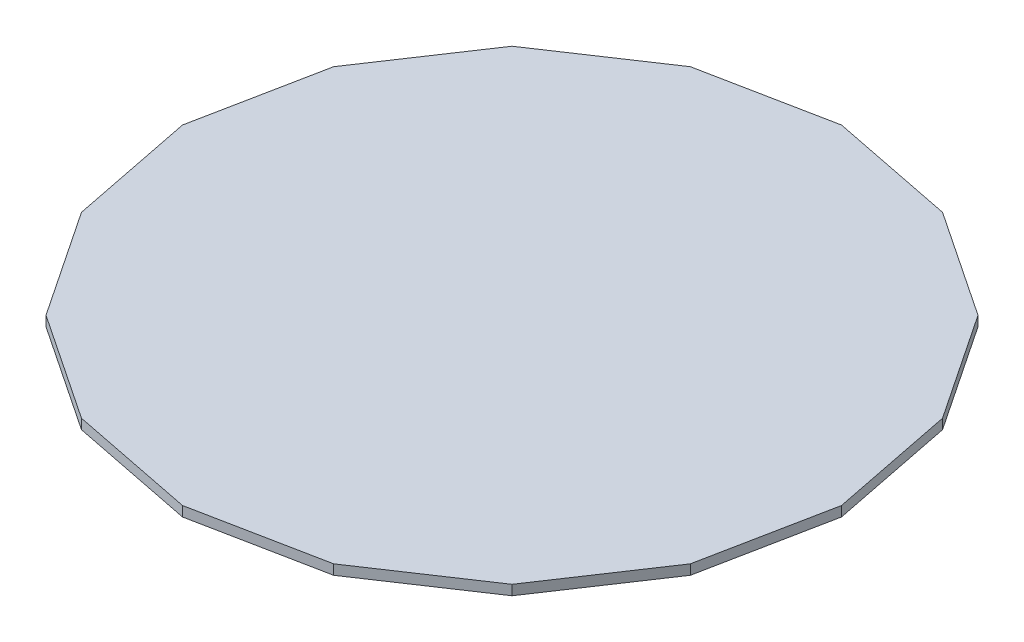
ISO-10303-21;
HEADER;
FILE_DESCRIPTION(('STEP AP214'),'2;1');
FILE_NAME('part.step','',(''),(''),'','','');
FILE_SCHEMA(('AUTOMOTIVE_DESIGN { 1 0 10303 214 1 1 1 1 }'));
ENDSEC;
DATA;
#1=APPLICATION_CONTEXT('core data for automotive mechanical design processes');
#2=APPLICATION_PROTOCOL_DEFINITION('international standard','automotive_design',2000,#1);
#3=PRODUCT_CONTEXT('',#1,'mechanical');
#4=PRODUCT('Part','Part','',(#3));
#5=PRODUCT_RELATED_PRODUCT_CATEGORY('part','',(#4));
#6=PRODUCT_DEFINITION_FORMATION('','',#4);
#7=PRODUCT_DEFINITION_CONTEXT('part definition',#1,'design');
#8=PRODUCT_DEFINITION('design','',#6,#7);
#9=PRODUCT_DEFINITION_SHAPE('','',#8);
#10=(LENGTH_UNIT() NAMED_UNIT(*) SI_UNIT(.MILLI.,.METRE.));
#11=(NAMED_UNIT(*) PLANE_ANGLE_UNIT() SI_UNIT($,.RADIAN.));
#12=(NAMED_UNIT(*) SI_UNIT($,.STERADIAN.) SOLID_ANGLE_UNIT());
#13=UNCERTAINTY_MEASURE_WITH_UNIT(LENGTH_MEASURE(1.E-05),#10,'distance_accuracy_value','');
#14=(GEOMETRIC_REPRESENTATION_CONTEXT(3) GLOBAL_UNCERTAINTY_ASSIGNED_CONTEXT((#13)) GLOBAL_UNIT_ASSIGNED_CONTEXT((#10,
#11,#12)) REPRESENTATION_CONTEXT('',''));
#15=CARTESIAN_POINT('',(0.,0.,0.));
#16=DIRECTION('',(0.,0.,1.));
#17=DIRECTION('',(1.,0.,0.));
#18=AXIS2_PLACEMENT_3D('',#15,#16,#17);
#19=CARTESIAN_POINT('',(61.2286611688793,2.,25.3617418620966));
#20=DIRECTION('',(-0.980785280403231,0.,-0.195090322016128));
#21=DIRECTION('',(-0.195090322016128,0.,0.98078528040323));
#22=AXIS2_PLACEMENT_3D('',#19,#20,#21);
#23=PLANE('',#22);
#24=DIRECTION('',(0.195090322016128,0.,-0.980785280403231));
#25=VECTOR('',#24,1.);
#26=CARTESIAN_POINT('',(61.2286611688793,0.,25.3617418620966));
#27=LINE('',#26,#25);
#28=CARTESIAN_POINT('',(61.2286611688793,0.,25.3617418620966));
#29=VERTEX_POINT('',#28);
#30=CARTESIAN_POINT('',(66.2734252835407,0.,0.));
#31=VERTEX_POINT('',#30);
#32=EDGE_CURVE('E194',#29,#31,#27,.T.);
#33=ORIENTED_EDGE('',*,*,#32,.T.);
#34=DIRECTION('',(0.,-1.,0.));
#35=VECTOR('',#34,1.);
#36=CARTESIAN_POINT('',(66.2734252835407,2.,0.));
#37=LINE('',#36,#35);
#38=CARTESIAN_POINT('',(66.2734252835407,2.,0.));
#39=VERTEX_POINT('',#38);
#40=EDGE_CURVE('E11',#39,#31,#37,.T.);
#41=ORIENTED_EDGE('',*,*,#40,.F.);
#42=DIRECTION('',(0.195090322016128,0.,-0.980785280403231));
#43=VECTOR('',#42,1.);
#44=CARTESIAN_POINT('',(61.2286611688793,2.,25.3617418620966));
#45=LINE('',#44,#43);
#46=CARTESIAN_POINT('',(61.2286611688793,2.,25.3617418620966));
#47=VERTEX_POINT('',#46);
#48=EDGE_CURVE('E240',#47,#39,#45,.T.);
#49=ORIENTED_EDGE('',*,*,#48,.F.);
#50=DIRECTION('',(0.,-1.,0.));
#51=VECTOR('',#50,1.);
#52=CARTESIAN_POINT('',(61.2286611688793,2.,25.3617418620966));
#53=LINE('',#52,#51);
#54=EDGE_CURVE('E190',#47,#29,#53,.T.);
#55=ORIENTED_EDGE('',*,*,#54,.T.);
#56=EDGE_LOOP('',(#33,#41,#49,#55));
#57=FACE_BOUND('',#56,.T.);
#58=ADVANCED_FACE('F45',(#57),#23,.F.);
#59=CARTESIAN_POINT('',(66.2734252835407,2.,0.));
#60=DIRECTION('',(-0.980785280403231,0.,0.195090322016128));
#61=DIRECTION('',(0.195090322016128,0.,0.98078528040323));
#62=AXIS2_PLACEMENT_3D('',#59,#60,#61);
#63=PLANE('',#62);
#64=DIRECTION('',(-0.195090322016128,0.,-0.980785280403231));
#65=VECTOR('',#64,1.);
#66=CARTESIAN_POINT('',(66.2734252835407,0.,0.));
#67=LINE('',#66,#65);
#68=CARTESIAN_POINT('',(61.2286611688793,0.,-25.3617418620967));
#69=VERTEX_POINT('',#68);
#70=EDGE_CURVE('E198',#31,#69,#67,.T.);
#71=ORIENTED_EDGE('',*,*,#70,.T.);
#72=DIRECTION('',(0.,-1.,0.));
#73=VECTOR('',#72,1.);
#74=CARTESIAN_POINT('',(61.2286611688793,2.,-25.3617418620967));
#75=LINE('',#74,#73);
#76=CARTESIAN_POINT('',(61.2286611688793,2.,-25.3617418620967));
#77=VERTEX_POINT('',#76);
#78=EDGE_CURVE('E54',#77,#69,#75,.T.);
#79=ORIENTED_EDGE('',*,*,#78,.F.);
#80=DIRECTION('',(-0.195090322016128,0.,-0.980785280403231));
#81=VECTOR('',#80,1.);
#82=CARTESIAN_POINT('',(66.2734252835407,2.,0.));
#83=LINE('',#82,#81);
#84=EDGE_CURVE('E129',#39,#77,#83,.T.);
#85=ORIENTED_EDGE('',*,*,#84,.F.);
#86=ORIENTED_EDGE('',*,*,#40,.T.);
#87=EDGE_LOOP('',(#71,#79,#85,#86));
#88=FACE_BOUND('',#87,.T.);
#89=ADVANCED_FACE('F362',(#88),#63,.F.);
#90=CARTESIAN_POINT('',(61.2286611688793,2.,-25.3617418620967));
#91=DIRECTION('',(-0.831469612302545,0.,0.555570233019603));
#92=DIRECTION('',(0.555570233019603,0.,0.831469612302545));
#93=AXIS2_PLACEMENT_3D('',#90,#91,#92);
#94=PLANE('',#93);
#95=DIRECTION('',(-0.555570233019603,0.,-0.831469612302545));
#96=VECTOR('',#95,1.);
#97=CARTESIAN_POINT('',(61.2286611688793,0.,-25.3617418620967));
#98=LINE('',#97,#96);
#99=CARTESIAN_POINT('',(46.8623884304516,0.,-46.8623884304517));
#100=VERTEX_POINT('',#99);
#101=EDGE_CURVE('E201',#69,#100,#98,.T.);
#102=ORIENTED_EDGE('',*,*,#101,.T.);
#103=DIRECTION('',(0.,-1.,0.));
#104=VECTOR('',#103,1.);
#105=CARTESIAN_POINT('',(46.8623884304516,2.,-46.8623884304517));
#106=LINE('',#105,#104);
#107=CARTESIAN_POINT('',(46.8623884304516,2.,-46.8623884304517));
#108=VERTEX_POINT('',#107);
#109=EDGE_CURVE('E283',#108,#100,#106,.T.);
#110=ORIENTED_EDGE('',*,*,#109,.F.);
#111=DIRECTION('',(-0.555570233019603,0.,-0.831469612302545));
#112=VECTOR('',#111,1.);
#113=CARTESIAN_POINT('',(61.2286611688793,2.,-25.3617418620967));
#114=LINE('',#113,#112);
#115=EDGE_CURVE('E293',#77,#108,#114,.T.);
#116=ORIENTED_EDGE('',*,*,#115,.F.);
#117=ORIENTED_EDGE('',*,*,#78,.T.);
#118=EDGE_LOOP('',(#102,#110,#116,#117));
#119=FACE_BOUND('',#118,.T.);
#120=ADVANCED_FACE('F291',(#119),#94,.F.);
#121=CARTESIAN_POINT('',(46.8623884304516,2.,-46.8623884304517));
#122=DIRECTION('',(-0.555570233019602,0.,0.831469612302546));
#123=DIRECTION('',(0.831469612302546,0.,0.555570233019602));
#124=AXIS2_PLACEMENT_3D('',#121,#122,#123);
#125=PLANE('',#124);
#126=DIRECTION('',(-0.831469612302545,0.,-0.555570233019602));
#127=VECTOR('',#126,1.);
#128=CARTESIAN_POINT('',(46.8623884304516,0.,-46.8623884304517));
#129=LINE('',#128,#127);
#130=CARTESIAN_POINT('',(25.3617418620967,0.,-61.2286611688793));
#131=VERTEX_POINT('',#130);
#132=EDGE_CURVE('E204',#100,#131,#129,.T.);
#133=ORIENTED_EDGE('',*,*,#132,.T.);
#134=DIRECTION('',(0.,-1.,0.));
#135=VECTOR('',#134,1.);
#136=CARTESIAN_POINT('',(25.3617418620967,2.,-61.2286611688793));
#137=LINE('',#136,#135);
#138=CARTESIAN_POINT('',(25.3617418620967,2.,-61.2286611688793));
#139=VERTEX_POINT('',#138);
#140=EDGE_CURVE('E279',#139,#131,#137,.T.);
#141=ORIENTED_EDGE('',*,*,#140,.F.);
#142=DIRECTION('',(-0.831469612302545,0.,-0.555570233019602));
#143=VECTOR('',#142,1.);
#144=CARTESIAN_POINT('',(46.8623884304516,2.,-46.8623884304517));
#145=LINE('',#144,#143);
#146=EDGE_CURVE('E312',#108,#139,#145,.T.);
#147=ORIENTED_EDGE('',*,*,#146,.F.);
#148=ORIENTED_EDGE('',*,*,#109,.T.);
#149=EDGE_LOOP('',(#133,#141,#147,#148));
#150=FACE_BOUND('',#149,.T.);
#151=ADVANCED_FACE('F302',(#150),#125,.F.);
#152=CARTESIAN_POINT('',(25.3617418620967,2.,-61.2286611688793));
#153=DIRECTION('',(-0.195090322016128,0.,0.98078528040323));
#154=DIRECTION('',(0.98078528040323,0.,0.195090322016128));
#155=AXIS2_PLACEMENT_3D('',#152,#153,#154);
#156=PLANE('',#155);
#157=DIRECTION('',(-0.98078528040323,0.,-0.195090322016128));
#158=VECTOR('',#157,1.);
#159=CARTESIAN_POINT('',(25.3617418620967,0.,-61.2286611688793));
#160=LINE('',#159,#158);
#161=CARTESIAN_POINT('',(0.,0.,-66.2734252835407));
#162=VERTEX_POINT('',#161);
#163=EDGE_CURVE('E207',#131,#162,#160,.T.);
#164=ORIENTED_EDGE('',*,*,#163,.T.);
#165=DIRECTION('',(0.,-1.,0.));
#166=VECTOR('',#165,1.);
#167=CARTESIAN_POINT('',(0.,2.,-66.2734252835407));
#168=LINE('',#167,#166);
#169=CARTESIAN_POINT('',(0.,2.,-66.2734252835407));
#170=VERTEX_POINT('',#169);
#171=EDGE_CURVE('E275',#170,#162,#168,.T.);
#172=ORIENTED_EDGE('',*,*,#171,.F.);
#173=DIRECTION('',(-0.98078528040323,0.,-0.195090322016128));
#174=VECTOR('',#173,1.);
#175=CARTESIAN_POINT('',(25.3617418620967,2.,-61.2286611688793));
#176=LINE('',#175,#174);
#177=EDGE_CURVE('E308',#139,#170,#176,.T.);
#178=ORIENTED_EDGE('',*,*,#177,.F.);
#179=ORIENTED_EDGE('',*,*,#140,.T.);
#180=EDGE_LOOP('',(#164,#172,#178,#179));
#181=FACE_BOUND('',#180,.T.);
#182=ADVANCED_FACE('F306',(#181),#156,.F.);
#183=CARTESIAN_POINT('',(0.,2.,-66.2734252835407));
#184=DIRECTION('',(0.195090322016128,0.,0.98078528040323));
#185=DIRECTION('',(0.980785280403231,0.,-0.195090322016128));
#186=AXIS2_PLACEMENT_3D('',#183,#184,#185);
#187=PLANE('',#186);
#188=DIRECTION('',(-0.980785280403231,0.,0.195090322016128));
#189=VECTOR('',#188,1.);
#190=CARTESIAN_POINT('',(0.,0.,-66.2734252835407));
#191=LINE('',#190,#189);
#192=CARTESIAN_POINT('',(-25.3617418620967,0.,-61.2286611688793));
#193=VERTEX_POINT('',#192);
#194=EDGE_CURVE('E210',#162,#193,#191,.T.);
#195=ORIENTED_EDGE('',*,*,#194,.T.);
#196=DIRECTION('',(0.,-1.,0.));
#197=VECTOR('',#196,1.);
#198=CARTESIAN_POINT('',(-25.3617418620967,2.,-61.2286611688793));
#199=LINE('',#198,#197);
#200=CARTESIAN_POINT('',(-25.3617418620967,2.,-61.2286611688793));
#201=VERTEX_POINT('',#200);
#202=EDGE_CURVE('E271',#201,#193,#199,.T.);
#203=ORIENTED_EDGE('',*,*,#202,.F.);
#204=DIRECTION('',(-0.980785280403231,0.,0.195090322016128));
#205=VECTOR('',#204,1.);
#206=CARTESIAN_POINT('',(0.,2.,-66.2734252835407));
#207=LINE('',#206,#205);
#208=EDGE_CURVE('E311',#170,#201,#207,.T.);
#209=ORIENTED_EDGE('',*,*,#208,.F.);
#210=ORIENTED_EDGE('',*,*,#171,.T.);
#211=EDGE_LOOP('',(#195,#203,#209,#210));
#212=FACE_BOUND('',#211,.T.);
#213=ADVANCED_FACE('F375',(#212),#187,.F.);
#214=CARTESIAN_POINT('',(-25.3617418620967,2.,-61.2286611688793));
#215=DIRECTION('',(0.555570233019603,0.,0.831469612302545));
#216=DIRECTION('',(0.831469612302545,0.,-0.555570233019602));
#217=AXIS2_PLACEMENT_3D('',#214,#215,#216);
#218=PLANE('',#217);
#219=DIRECTION('',(-0.831469612302545,0.,0.555570233019603));
#220=VECTOR('',#219,1.);
#221=CARTESIAN_POINT('',(-25.3617418620967,0.,-61.2286611688793));
#222=LINE('',#221,#220);
#223=CARTESIAN_POINT('',(-46.8623884304516,0.,-46.8623884304516));
#224=VERTEX_POINT('',#223);
#225=EDGE_CURVE('E213',#193,#224,#222,.T.);
#226=ORIENTED_EDGE('',*,*,#225,.T.);
#227=DIRECTION('',(0.,-1.,0.));
#228=VECTOR('',#227,1.);
#229=CARTESIAN_POINT('',(-46.8623884304516,2.,-46.8623884304516));
#230=LINE('',#229,#228);
#231=CARTESIAN_POINT('',(-46.8623884304516,2.,-46.8623884304516));
#232=VERTEX_POINT('',#231);
#233=EDGE_CURVE('E267',#232,#224,#230,.T.);
#234=ORIENTED_EDGE('',*,*,#233,.F.);
#235=DIRECTION('',(-0.831469612302545,0.,0.555570233019603));
#236=VECTOR('',#235,1.);
#237=CARTESIAN_POINT('',(-25.3617418620967,2.,-61.2286611688793));
#238=LINE('',#237,#236);
#239=EDGE_CURVE('E316',#201,#232,#238,.T.);
#240=ORIENTED_EDGE('',*,*,#239,.F.);
#241=ORIENTED_EDGE('',*,*,#202,.T.);
#242=EDGE_LOOP('',(#226,#234,#240,#241));
#243=FACE_BOUND('',#242,.T.);
#244=ADVANCED_FACE('F378',(#243),#218,.F.);
#245=CARTESIAN_POINT('',(-46.8623884304516,2.,-46.8623884304516));
#246=DIRECTION('',(0.831469612302546,0.,0.555570233019602));
#247=DIRECTION('',(0.555570233019602,0.,-0.831469612302546));
#248=AXIS2_PLACEMENT_3D('',#245,#246,#247);
#249=PLANE('',#248);
#250=DIRECTION('',(-0.555570233019602,0.,0.831469612302545));
#251=VECTOR('',#250,1.);
#252=CARTESIAN_POINT('',(-46.8623884304516,0.,-46.8623884304516));
#253=LINE('',#252,#251);
#254=CARTESIAN_POINT('',(-61.2286611688793,0.,-25.3617418620966));
#255=VERTEX_POINT('',#254);
#256=EDGE_CURVE('E216',#224,#255,#253,.T.);
#257=ORIENTED_EDGE('',*,*,#256,.T.);
#258=DIRECTION('',(0.,-1.,0.));
#259=VECTOR('',#258,1.);
#260=CARTESIAN_POINT('',(-61.2286611688793,2.,-25.3617418620966));
#261=LINE('',#260,#259);
#262=CARTESIAN_POINT('',(-61.2286611688793,2.,-25.3617418620966));
#263=VERTEX_POINT('',#262);
#264=EDGE_CURVE('E263',#263,#255,#261,.T.);
#265=ORIENTED_EDGE('',*,*,#264,.F.);
#266=DIRECTION('',(-0.555570233019602,0.,0.831469612302545));
#267=VECTOR('',#266,1.);
#268=CARTESIAN_POINT('',(-46.8623884304516,2.,-46.8623884304516));
#269=LINE('',#268,#267);
#270=EDGE_CURVE('E323',#232,#263,#269,.T.);
#271=ORIENTED_EDGE('',*,*,#270,.F.);
#272=ORIENTED_EDGE('',*,*,#233,.T.);
#273=EDGE_LOOP('',(#257,#265,#271,#272));
#274=FACE_BOUND('',#273,.T.);
#275=ADVANCED_FACE('F382',(#274),#249,.F.);
#276=CARTESIAN_POINT('',(-61.2286611688793,2.,-25.3617418620966));
#277=DIRECTION('',(0.980785280403231,0.,0.195090322016128));
#278=DIRECTION('',(0.195090322016128,0.,-0.980785280403231));
#279=AXIS2_PLACEMENT_3D('',#276,#277,#278);
#280=PLANE('',#279);
#281=DIRECTION('',(-0.195090322016128,0.,0.980785280403231));
#282=VECTOR('',#281,1.);
#283=CARTESIAN_POINT('',(-61.2286611688793,0.,-25.3617418620966));
#284=LINE('',#283,#282);
#285=CARTESIAN_POINT('',(-66.2734252835407,0.,0.));
#286=VERTEX_POINT('',#285);
#287=EDGE_CURVE('E219',#255,#286,#284,.T.);
#288=ORIENTED_EDGE('',*,*,#287,.T.);
#289=DIRECTION('',(0.,-1.,0.));
#290=VECTOR('',#289,1.);
#291=CARTESIAN_POINT('',(-66.2734252835407,2.,0.));
#292=LINE('',#291,#290);
#293=CARTESIAN_POINT('',(-66.2734252835407,2.,0.));
#294=VERTEX_POINT('',#293);
#295=EDGE_CURVE('E259',#294,#286,#292,.T.);
#296=ORIENTED_EDGE('',*,*,#295,.F.);
#297=DIRECTION('',(-0.195090322016128,0.,0.980785280403231));
#298=VECTOR('',#297,1.);
#299=CARTESIAN_POINT('',(-61.2286611688793,2.,-25.3617418620966));
#300=LINE('',#299,#298);
#301=EDGE_CURVE('E326',#263,#294,#300,.T.);
#302=ORIENTED_EDGE('',*,*,#301,.F.);
#303=ORIENTED_EDGE('',*,*,#264,.T.);
#304=EDGE_LOOP('',(#288,#296,#302,#303));
#305=FACE_BOUND('',#304,.T.);
#306=ADVANCED_FACE('F386',(#305),#280,.F.);
#307=CARTESIAN_POINT('',(-66.2734252835407,2.,0.));
#308=DIRECTION('',(0.98078528040323,0.,-0.195090322016128));
#309=DIRECTION('',(-0.195090322016128,0.,-0.980785280403231));
#310=AXIS2_PLACEMENT_3D('',#307,#308,#309);
#311=PLANE('',#310);
#312=DIRECTION('',(0.195090322016128,0.,0.98078528040323));
#313=VECTOR('',#312,1.);
#314=CARTESIAN_POINT('',(-66.2734252835407,0.,0.));
#315=LINE('',#314,#313);
#316=CARTESIAN_POINT('',(-61.2286611688793,0.,25.3617418620967));
#317=VERTEX_POINT('',#316);
#318=EDGE_CURVE('E222',#286,#317,#315,.T.);
#319=ORIENTED_EDGE('',*,*,#318,.T.);
#320=DIRECTION('',(0.,-1.,0.));
#321=VECTOR('',#320,1.);
#322=CARTESIAN_POINT('',(-61.2286611688793,2.,25.3617418620967));
#323=LINE('',#322,#321);
#324=CARTESIAN_POINT('',(-61.2286611688793,2.,25.3617418620967));
#325=VERTEX_POINT('',#324);
#326=EDGE_CURVE('E255',#325,#317,#323,.T.);
#327=ORIENTED_EDGE('',*,*,#326,.F.);
#328=DIRECTION('',(0.195090322016128,0.,0.98078528040323));
#329=VECTOR('',#328,1.);
#330=CARTESIAN_POINT('',(-66.2734252835407,2.,0.));
#331=LINE('',#330,#329);
#332=EDGE_CURVE('E329',#294,#325,#331,.T.);
#333=ORIENTED_EDGE('',*,*,#332,.F.);
#334=ORIENTED_EDGE('',*,*,#295,.T.);
#335=EDGE_LOOP('',(#319,#327,#333,#334));
#336=FACE_BOUND('',#335,.T.);
#337=ADVANCED_FACE('F390',(#336),#311,.F.);
#338=CARTESIAN_POINT('',(-61.2286611688793,2.,25.3617418620967));
#339=DIRECTION('',(0.831469612302545,0.,-0.555570233019603));
#340=DIRECTION('',(-0.555570233019603,0.,-0.831469612302545));
#341=AXIS2_PLACEMENT_3D('',#338,#339,#340);
#342=PLANE('',#341);
#343=DIRECTION('',(0.555570233019603,0.,0.831469612302545));
#344=VECTOR('',#343,1.);
#345=CARTESIAN_POINT('',(-61.2286611688793,0.,25.3617418620967));
#346=LINE('',#345,#344);
#347=CARTESIAN_POINT('',(-46.8623884304516,0.,46.8623884304516));
#348=VERTEX_POINT('',#347);
#349=EDGE_CURVE('E225',#317,#348,#346,.T.);
#350=ORIENTED_EDGE('',*,*,#349,.T.);
#351=DIRECTION('',(0.,-1.,0.));
#352=VECTOR('',#351,1.);
#353=CARTESIAN_POINT('',(-46.8623884304516,2.,46.8623884304516));
#354=LINE('',#353,#352);
#355=CARTESIAN_POINT('',(-46.8623884304516,2.,46.8623884304516));
#356=VERTEX_POINT('',#355);
#357=EDGE_CURVE('E251',#356,#348,#354,.T.);
#358=ORIENTED_EDGE('',*,*,#357,.F.);
#359=DIRECTION('',(0.555570233019603,0.,0.831469612302545));
#360=VECTOR('',#359,1.);
#361=CARTESIAN_POINT('',(-61.2286611688793,2.,25.3617418620967));
#362=LINE('',#361,#360);
#363=EDGE_CURVE('E332',#325,#356,#362,.T.);
#364=ORIENTED_EDGE('',*,*,#363,.F.);
#365=ORIENTED_EDGE('',*,*,#326,.T.);
#366=EDGE_LOOP('',(#350,#358,#364,#365));
#367=FACE_BOUND('',#366,.T.);
#368=ADVANCED_FACE('F394',(#367),#342,.F.);
#369=CARTESIAN_POINT('',(-46.8623884304516,2.,46.8623884304516));
#370=DIRECTION('',(0.555570233019602,0.,-0.831469612302546));
#371=DIRECTION('',(-0.831469612302546,0.,-0.555570233019602));
#372=AXIS2_PLACEMENT_3D('',#369,#370,#371);
#373=PLANE('',#372);
#374=DIRECTION('',(0.831469612302545,0.,0.555570233019602));
#375=VECTOR('',#374,1.);
#376=CARTESIAN_POINT('',(-46.8623884304516,0.,46.8623884304516));
#377=LINE('',#376,#375);
#378=CARTESIAN_POINT('',(-25.3617418620967,0.,61.2286611688793));
#379=VERTEX_POINT('',#378);
#380=EDGE_CURVE('E228',#348,#379,#377,.T.);
#381=ORIENTED_EDGE('',*,*,#380,.T.);
#382=DIRECTION('',(0.,-1.,0.));
#383=VECTOR('',#382,1.);
#384=CARTESIAN_POINT('',(-25.3617418620967,2.,61.2286611688793));
#385=LINE('',#384,#383);
#386=CARTESIAN_POINT('',(-25.3617418620967,2.,61.2286611688793));
#387=VERTEX_POINT('',#386);
#388=EDGE_CURVE('E247',#387,#379,#385,.T.);
#389=ORIENTED_EDGE('',*,*,#388,.F.);
#390=DIRECTION('',(0.831469612302545,0.,0.555570233019602));
#391=VECTOR('',#390,1.);
#392=CARTESIAN_POINT('',(-46.8623884304516,2.,46.8623884304516));
#393=LINE('',#392,#391);
#394=EDGE_CURVE('E335',#356,#387,#393,.T.);
#395=ORIENTED_EDGE('',*,*,#394,.F.);
#396=ORIENTED_EDGE('',*,*,#357,.T.);
#397=EDGE_LOOP('',(#381,#389,#395,#396));
#398=FACE_BOUND('',#397,.T.);
#399=ADVANCED_FACE('F343',(#398),#373,.F.);
#400=CARTESIAN_POINT('',(-25.3617418620967,2.,61.2286611688793));
#401=DIRECTION('',(0.195090322016129,0.,-0.98078528040323));
#402=DIRECTION('',(-0.98078528040323,0.,-0.195090322016129));
#403=AXIS2_PLACEMENT_3D('',#400,#401,#402);
#404=PLANE('',#403);
#405=DIRECTION('',(0.98078528040323,0.,0.195090322016129));
#406=VECTOR('',#405,1.);
#407=CARTESIAN_POINT('',(-25.3617418620967,0.,61.2286611688793));
#408=LINE('',#407,#406);
#409=CARTESIAN_POINT('',(0.,0.,66.2734252835407));
#410=VERTEX_POINT('',#409);
#411=EDGE_CURVE('E231',#379,#410,#408,.T.);
#412=ORIENTED_EDGE('',*,*,#411,.T.);
#413=DIRECTION('',(0.,-1.,0.));
#414=VECTOR('',#413,1.);
#415=CARTESIAN_POINT('',(0.,2.,66.2734252835407));
#416=LINE('',#415,#414);
#417=CARTESIAN_POINT('',(0.,2.,66.2734252835407));
#418=VERTEX_POINT('',#417);
#419=EDGE_CURVE('E183',#418,#410,#416,.T.);
#420=ORIENTED_EDGE('',*,*,#419,.F.);
#421=DIRECTION('',(0.98078528040323,0.,0.195090322016129));
#422=VECTOR('',#421,1.);
#423=CARTESIAN_POINT('',(-25.3617418620967,2.,61.2286611688793));
#424=LINE('',#423,#422);
#425=EDGE_CURVE('E172',#387,#418,#424,.T.);
#426=ORIENTED_EDGE('',*,*,#425,.F.);
#427=ORIENTED_EDGE('',*,*,#388,.T.);
#428=EDGE_LOOP('',(#412,#420,#426,#427));
#429=FACE_BOUND('',#428,.T.);
#430=ADVANCED_FACE('F347',(#429),#404,.F.);
#431=CARTESIAN_POINT('',(0.,2.,66.2734252835407));
#432=DIRECTION('',(-0.195090322016128,0.,-0.98078528040323));
#433=DIRECTION('',(-0.98078528040323,0.,0.195090322016128));
#434=AXIS2_PLACEMENT_3D('',#431,#432,#433);
#435=PLANE('',#434);
#436=DIRECTION('',(0.980785280403231,0.,-0.195090322016128));
#437=VECTOR('',#436,1.);
#438=CARTESIAN_POINT('',(0.,0.,66.2734252835407));
#439=LINE('',#438,#437);
#440=CARTESIAN_POINT('',(25.3617418620967,0.,61.2286611688793));
#441=VERTEX_POINT('',#440);
#442=EDGE_CURVE('E181',#410,#441,#439,.T.);
#443=ORIENTED_EDGE('',*,*,#442,.T.);
#444=DIRECTION('',(0.,-1.,0.));
#445=VECTOR('',#444,1.);
#446=CARTESIAN_POINT('',(25.3617418620967,2.,61.2286611688793));
#447=LINE('',#446,#445);
#448=CARTESIAN_POINT('',(25.3617418620967,2.,61.2286611688793));
#449=VERTEX_POINT('',#448);
#450=EDGE_CURVE('E178',#449,#441,#447,.T.);
#451=ORIENTED_EDGE('',*,*,#450,.F.);
#452=DIRECTION('',(0.980785280403231,0.,-0.195090322016128));
#453=VECTOR('',#452,1.);
#454=CARTESIAN_POINT('',(0.,2.,66.2734252835407));
#455=LINE('',#454,#453);
#456=EDGE_CURVE('E166',#418,#449,#455,.T.);
#457=ORIENTED_EDGE('',*,*,#456,.F.);
#458=ORIENTED_EDGE('',*,*,#419,.T.);
#459=EDGE_LOOP('',(#443,#451,#457,#458));
#460=FACE_BOUND('',#459,.T.);
#461=ADVANCED_FACE('F179',(#460),#435,.F.);
#462=CARTESIAN_POINT('',(25.3617418620967,2.,61.2286611688793));
#463=DIRECTION('',(-0.555570233019603,0.,-0.831469612302545));
#464=DIRECTION('',(-0.831469612302545,0.,0.555570233019603));
#465=AXIS2_PLACEMENT_3D('',#462,#463,#464);
#466=PLANE('',#465);
#467=DIRECTION('',(0.831469612302545,0.,-0.555570233019603));
#468=VECTOR('',#467,1.);
#469=CARTESIAN_POINT('',(25.3617418620967,0.,61.2286611688793));
#470=LINE('',#469,#468);
#471=CARTESIAN_POINT('',(46.8623884304516,0.,46.8623884304516));
#472=VERTEX_POINT('',#471);
#473=EDGE_CURVE('E115',#441,#472,#470,.T.);
#474=ORIENTED_EDGE('',*,*,#473,.T.);
#475=DIRECTION('',(0.,-1.,0.));
#476=VECTOR('',#475,1.);
#477=CARTESIAN_POINT('',(46.8623884304516,2.,46.8623884304516));
#478=LINE('',#477,#476);
#479=CARTESIAN_POINT('',(46.8623884304516,2.,46.8623884304516));
#480=VERTEX_POINT('',#479);
#481=EDGE_CURVE('E184',#480,#472,#478,.T.);
#482=ORIENTED_EDGE('',*,*,#481,.F.);
#483=DIRECTION('',(0.831469612302545,0.,-0.555570233019603));
#484=VECTOR('',#483,1.);
#485=CARTESIAN_POINT('',(25.3617418620967,2.,61.2286611688793));
#486=LINE('',#485,#484);
#487=EDGE_CURVE('E170',#449,#480,#486,.T.);
#488=ORIENTED_EDGE('',*,*,#487,.F.);
#489=ORIENTED_EDGE('',*,*,#450,.T.);
#490=EDGE_LOOP('',(#474,#482,#488,#489));
#491=FACE_BOUND('',#490,.T.);
#492=ADVANCED_FACE('F186',(#491),#466,.F.);
#493=CARTESIAN_POINT('',(46.8623884304516,2.,46.8623884304516));
#494=DIRECTION('',(-0.831469612302545,0.,-0.555570233019602));
#495=DIRECTION('',(-0.555570233019602,0.,0.831469612302545));
#496=AXIS2_PLACEMENT_3D('',#493,#494,#495);
#497=PLANE('',#496);
#498=DIRECTION('',(0.555570233019602,0.,-0.831469612302545));
#499=VECTOR('',#498,1.);
#500=CARTESIAN_POINT('',(46.8623884304516,0.,46.8623884304516));
#501=LINE('',#500,#499);
#502=EDGE_CURVE('E121',#472,#29,#501,.T.);
#503=ORIENTED_EDGE('',*,*,#502,.T.);
#504=ORIENTED_EDGE('',*,*,#54,.F.);
#505=DIRECTION('',(0.555570233019602,0.,-0.831469612302545));
#506=VECTOR('',#505,1.);
#507=CARTESIAN_POINT('',(46.8623884304516,2.,46.8623884304516));
#508=LINE('',#507,#506);
#509=EDGE_CURVE('E62',#480,#47,#508,.T.);
#510=ORIENTED_EDGE('',*,*,#509,.F.);
#511=ORIENTED_EDGE('',*,*,#481,.T.);
#512=EDGE_LOOP('',(#503,#504,#510,#511));
#513=FACE_BOUND('',#512,.T.);
#514=ADVANCED_FACE('F351',(#513),#497,.F.);
#515=CARTESIAN_POINT('',(0.,2.,0.));
#516=DIRECTION('',(0.,1.,0.));
#517=DIRECTION('',(0.,0.,1.));
#518=AXIS2_PLACEMENT_3D('',#515,#516,#517);
#519=PLANE('',#518);
#520=ORIENTED_EDGE('',*,*,#48,.T.);
#521=ORIENTED_EDGE('',*,*,#84,.T.);
#522=ORIENTED_EDGE('',*,*,#115,.T.);
#523=ORIENTED_EDGE('',*,*,#146,.T.);
#524=ORIENTED_EDGE('',*,*,#177,.T.);
#525=ORIENTED_EDGE('',*,*,#208,.T.);
#526=ORIENTED_EDGE('',*,*,#239,.T.);
#527=ORIENTED_EDGE('',*,*,#270,.T.);
#528=ORIENTED_EDGE('',*,*,#301,.T.);
#529=ORIENTED_EDGE('',*,*,#332,.T.);
#530=ORIENTED_EDGE('',*,*,#363,.T.);
#531=ORIENTED_EDGE('',*,*,#394,.T.);
#532=ORIENTED_EDGE('',*,*,#425,.T.);
#533=ORIENTED_EDGE('',*,*,#456,.T.);
#534=ORIENTED_EDGE('',*,*,#487,.T.);
#535=ORIENTED_EDGE('',*,*,#509,.T.);
#536=EDGE_LOOP('',(#520,#521,#522,#523,#524,#525,#526,#527,#528,#529,#530,#531,#532,#533,#534,#535));
#537=FACE_BOUND('',#536,.T.);
#538=ADVANCED_FACE('F168',(#537),#519,.T.);
#539=CARTESIAN_POINT('',(0.,0.,0.));
#540=DIRECTION('',(0.,1.,0.));
#541=DIRECTION('',(0.,0.,1.));
#542=AXIS2_PLACEMENT_3D('',#539,#540,#541);
#543=PLANE('',#542);
#544=ORIENTED_EDGE('',*,*,#32,.F.);
#545=ORIENTED_EDGE('',*,*,#502,.F.);
#546=ORIENTED_EDGE('',*,*,#473,.F.);
#547=ORIENTED_EDGE('',*,*,#442,.F.);
#548=ORIENTED_EDGE('',*,*,#411,.F.);
#549=ORIENTED_EDGE('',*,*,#380,.F.);
#550=ORIENTED_EDGE('',*,*,#349,.F.);
#551=ORIENTED_EDGE('',*,*,#318,.F.);
#552=ORIENTED_EDGE('',*,*,#287,.F.);
#553=ORIENTED_EDGE('',*,*,#256,.F.);
#554=ORIENTED_EDGE('',*,*,#225,.F.);
#555=ORIENTED_EDGE('',*,*,#194,.F.);
#556=ORIENTED_EDGE('',*,*,#163,.F.);
#557=ORIENTED_EDGE('',*,*,#132,.F.);
#558=ORIENTED_EDGE('',*,*,#101,.F.);
#559=ORIENTED_EDGE('',*,*,#70,.F.);
#560=EDGE_LOOP('',(#544,#545,#546,#547,#548,#549,#550,#551,#552,#553,#554,#555,#556,#557,#558,#559));
#561=FACE_BOUND('',#560,.T.);
#562=ADVANCED_FACE('F297',(#561),#543,.F.);
#563=CLOSED_SHELL('',(#58,#89,#120,#151,#182,#213,#244,#275,#306,#337,#368,#399,#430,#461,#492,
#514,#538,#562));
#564=MANIFOLD_SOLID_BREP('B2',#563);
#565=ADVANCED_BREP_SHAPE_REPRESENTATION('',(#18,#564),#14);
#566=SHAPE_DEFINITION_REPRESENTATION(#9,#565);
ENDSEC;
END-ISO-10303-21;
